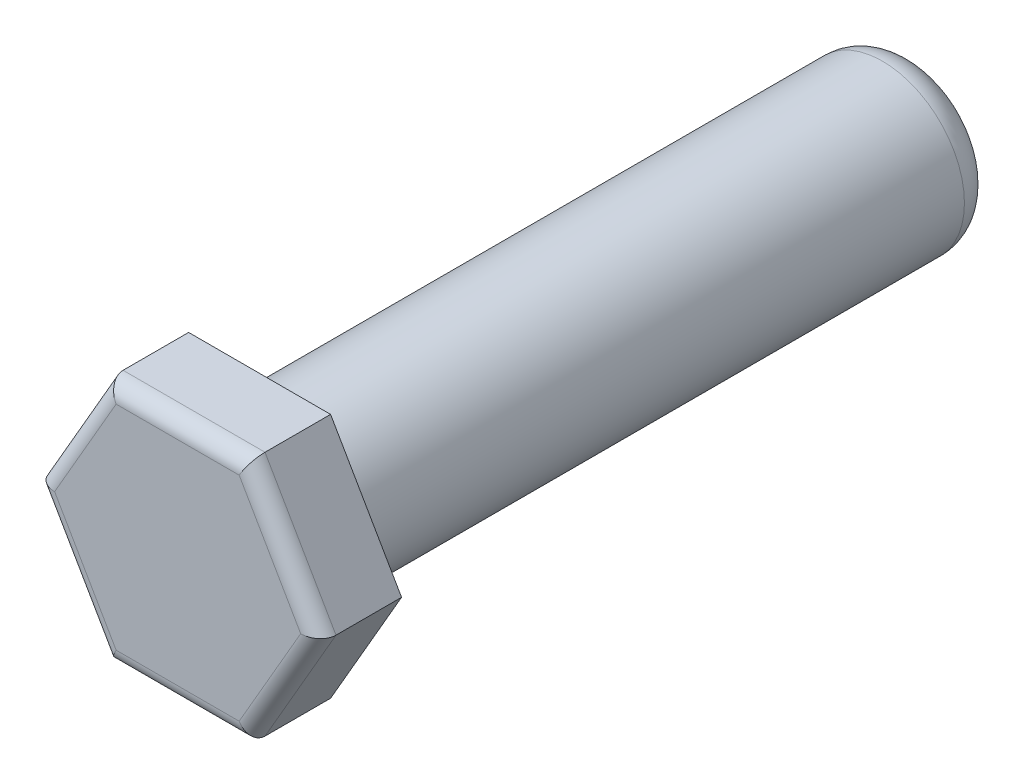
ISO-10303-21;
HEADER;
FILE_DESCRIPTION(('STEP AP214'),'2;1');
FILE_NAME('part.step','',(''),(''),'','','');
FILE_SCHEMA(('AUTOMOTIVE_DESIGN { 1 0 10303 214 1 1 1 1 }'));
ENDSEC;
DATA;
#1=APPLICATION_CONTEXT('core data for automotive mechanical design processes');
#2=APPLICATION_PROTOCOL_DEFINITION('international standard','automotive_design',2000,#1);
#3=PRODUCT_CONTEXT('',#1,'mechanical');
#4=PRODUCT('Part','Part','',(#3));
#5=PRODUCT_RELATED_PRODUCT_CATEGORY('part','',(#4));
#6=PRODUCT_DEFINITION_FORMATION('','',#4);
#7=PRODUCT_DEFINITION_CONTEXT('part definition',#1,'design');
#8=PRODUCT_DEFINITION('design','',#6,#7);
#9=PRODUCT_DEFINITION_SHAPE('','',#8);
#10=(LENGTH_UNIT() NAMED_UNIT(*) SI_UNIT(.MILLI.,.METRE.));
#11=(NAMED_UNIT(*) PLANE_ANGLE_UNIT() SI_UNIT($,.RADIAN.));
#12=(NAMED_UNIT(*) SI_UNIT($,.STERADIAN.) SOLID_ANGLE_UNIT());
#13=UNCERTAINTY_MEASURE_WITH_UNIT(LENGTH_MEASURE(1.E-05),#10,'distance_accuracy_value','');
#14=(GEOMETRIC_REPRESENTATION_CONTEXT(3) GLOBAL_UNCERTAINTY_ASSIGNED_CONTEXT((#13)) GLOBAL_UNIT_ASSIGNED_CONTEXT((#10,
#11,#12)) REPRESENTATION_CONTEXT('',''));
#15=CARTESIAN_POINT('',(0.,0.,0.));
#16=DIRECTION('',(0.,0.,1.));
#17=DIRECTION('',(1.,0.,0.));
#18=AXIS2_PLACEMENT_3D('',#15,#16,#17);
#19=CARTESIAN_POINT('',(0.,0.,40.));
#20=DIRECTION('',(0.,0.,-1.));
#21=DIRECTION('',(-1.,0.,0.));
#22=AXIS2_PLACEMENT_3D('',#19,#20,#21);
#23=CYLINDRICAL_SURFACE('',#22,5.);
#24=CARTESIAN_POINT('',(0.,0.,2.));
#25=DIRECTION('',(0.,0.,1.));
#26=DIRECTION('',(1.,0.,0.));
#27=AXIS2_PLACEMENT_3D('',#24,#25,#26);
#28=CIRCLE('',#27,5.);
#29=CARTESIAN_POINT('',(5.,0.,2.));
#30=VERTEX_POINT('',#29);
#31=EDGE_CURVE('E42',#30,#30,#28,.T.);
#32=ORIENTED_EDGE('',*,*,#31,.T.);
#33=EDGE_LOOP('',(#32));
#34=FACE_BOUND('',#33,.T.);
#35=CARTESIAN_POINT('',(0.,0.,40.));
#36=DIRECTION('',(0.,0.,1.));
#37=DIRECTION('',(1.,0.,0.));
#38=AXIS2_PLACEMENT_3D('',#35,#36,#37);
#39=CIRCLE('',#38,5.);
#40=CARTESIAN_POINT('',(5.,0.,40.));
#41=VERTEX_POINT('',#40);
#42=EDGE_CURVE('E117',#41,#41,#39,.T.);
#43=ORIENTED_EDGE('',*,*,#42,.F.);
#44=EDGE_LOOP('',(#43));
#45=FACE_BOUND('',#44,.T.);
#46=ADVANCED_FACE('F34',(#34,#45),#23,.T.);
#47=CARTESIAN_POINT('',(0.,0.,0.));
#48=DIRECTION('',(0.,0.,1.));
#49=DIRECTION('',(1.,0.,0.));
#50=AXIS2_PLACEMENT_3D('',#47,#48,#49);
#51=PLANE('',#50);
#52=CARTESIAN_POINT('',(0.,0.,0.));
#53=DIRECTION('',(0.,0.,1.));
#54=DIRECTION('',(1.,0.,0.));
#55=AXIS2_PLACEMENT_3D('',#52,#53,#54);
#56=CIRCLE('',#55,3.);
#57=CARTESIAN_POINT('',(3.,0.,0.));
#58=VERTEX_POINT('',#57);
#59=EDGE_CURVE('E11',#58,#58,#56,.F.);
#60=ORIENTED_EDGE('',*,*,#59,.T.);
#61=EDGE_LOOP('',(#60));
#62=FACE_BOUND('',#61,.T.);
#63=ADVANCED_FACE('F208',(#62),#51,.F.);
#64=CARTESIAN_POINT('',(0.,0.,40.));
#65=DIRECTION('',(0.,0.,1.));
#66=DIRECTION('',(1.,0.,0.));
#67=AXIS2_PLACEMENT_3D('',#64,#65,#66);
#68=PLANE('',#67);
#69=DIRECTION('',(1.,0.,0.));
#70=VECTOR('',#69,1.);
#71=CARTESIAN_POINT('',(-4.33012701892219,-7.5,40.));
#72=LINE('',#71,#70);
#73=CARTESIAN_POINT('',(-4.33012701892219,-7.5,40.));
#74=VERTEX_POINT('',#73);
#75=CARTESIAN_POINT('',(4.33012701892219,-7.5,40.));
#76=VERTEX_POINT('',#75);
#77=EDGE_CURVE('E125',#74,#76,#72,.T.);
#78=ORIENTED_EDGE('',*,*,#77,.F.);
#79=DIRECTION('',(0.5,-0.866025403784438,0.));
#80=VECTOR('',#79,1.);
#81=CARTESIAN_POINT('',(-8.66025403784439,0.,40.));
#82=LINE('',#81,#80);
#83=CARTESIAN_POINT('',(-8.66025403784439,0.,40.));
#84=VERTEX_POINT('',#83);
#85=EDGE_CURVE('E146',#84,#74,#82,.T.);
#86=ORIENTED_EDGE('',*,*,#85,.F.);
#87=DIRECTION('',(-0.5,-0.866025403784439,0.));
#88=VECTOR('',#87,1.);
#89=CARTESIAN_POINT('',(-4.33012701892219,7.5,40.));
#90=LINE('',#89,#88);
#91=CARTESIAN_POINT('',(-4.33012701892219,7.5,40.));
#92=VERTEX_POINT('',#91);
#93=EDGE_CURVE('E143',#92,#84,#90,.T.);
#94=ORIENTED_EDGE('',*,*,#93,.F.);
#95=DIRECTION('',(-1.,0.,0.));
#96=VECTOR('',#95,1.);
#97=CARTESIAN_POINT('',(4.33012701892219,7.5,40.));
#98=LINE('',#97,#96);
#99=CARTESIAN_POINT('',(4.33012701892219,7.5,40.));
#100=VERTEX_POINT('',#99);
#101=EDGE_CURVE('E140',#100,#92,#98,.T.);
#102=ORIENTED_EDGE('',*,*,#101,.F.);
#103=DIRECTION('',(-0.500000000000001,0.866025403784438,0.));
#104=VECTOR('',#103,1.);
#105=CARTESIAN_POINT('',(8.66025403784439,0.,40.));
#106=LINE('',#105,#104);
#107=CARTESIAN_POINT('',(8.66025403784439,0.,40.));
#108=VERTEX_POINT('',#107);
#109=EDGE_CURVE('E128',#108,#100,#106,.T.);
#110=ORIENTED_EDGE('',*,*,#109,.F.);
#111=DIRECTION('',(0.5,0.866025403784439,0.));
#112=VECTOR('',#111,1.);
#113=CARTESIAN_POINT('',(4.33012701892219,-7.5,40.));
#114=LINE('',#113,#112);
#115=EDGE_CURVE('E110',#76,#108,#114,.T.);
#116=ORIENTED_EDGE('',*,*,#115,.F.);
#117=EDGE_LOOP('',(#78,#86,#94,#102,#110,#116));
#118=FACE_BOUND('',#117,.T.);
#119=ORIENTED_EDGE('',*,*,#42,.T.);
#120=EDGE_LOOP('',(#119));
#121=FACE_BOUND('',#120,.T.);
#122=ADVANCED_FACE('F122',(#118,#121),#68,.F.);
#123=CARTESIAN_POINT('',(-4.33012701892219,-7.5,45.));
#124=DIRECTION('',(0.,1.,0.));
#125=DIRECTION('',(-1.,0.,0.));
#126=AXIS2_PLACEMENT_3D('',#123,#124,#125);
#127=PLANE('',#126);
#128=DIRECTION('',(0.,0.,-1.));
#129=VECTOR('',#128,1.);
#130=CARTESIAN_POINT('',(4.33012701892219,-7.5,45.));
#131=LINE('',#130,#129);
#132=CARTESIAN_POINT('',(4.33012701892219,-7.5,44.));
#133=VERTEX_POINT('',#132);
#134=EDGE_CURVE('E106',#133,#76,#131,.T.);
#135=ORIENTED_EDGE('',*,*,#134,.F.);
#136=DIRECTION('',(1.,0.,0.));
#137=VECTOR('',#136,1.);
#138=CARTESIAN_POINT('',(-4.33012701892219,-7.5,44.));
#139=LINE('',#138,#137);
#140=CARTESIAN_POINT('',(-4.33012701892219,-7.5,44.));
#141=VERTEX_POINT('',#140);
#142=EDGE_CURVE('E175',#133,#141,#139,.F.);
#143=ORIENTED_EDGE('',*,*,#142,.T.);
#144=DIRECTION('',(0.,0.,-1.));
#145=VECTOR('',#144,1.);
#146=CARTESIAN_POINT('',(-4.33012701892219,-7.5,45.));
#147=LINE('',#146,#145);
#148=EDGE_CURVE('E131',#141,#74,#147,.T.);
#149=ORIENTED_EDGE('',*,*,#148,.T.);
#150=ORIENTED_EDGE('',*,*,#77,.T.);
#151=EDGE_LOOP('',(#135,#143,#149,#150));
#152=FACE_BOUND('',#151,.T.);
#153=ADVANCED_FACE('F130',(#152),#127,.F.);
#154=CARTESIAN_POINT('',(4.33012701892219,-7.5,45.));
#155=DIRECTION('',(-0.866025403784439,0.5,0.));
#156=DIRECTION('',(-0.5,-0.866025403784439,0.));
#157=AXIS2_PLACEMENT_3D('',#154,#155,#156);
#158=PLANE('',#157);
#159=DIRECTION('',(0.,0.,-1.));
#160=VECTOR('',#159,1.);
#161=CARTESIAN_POINT('',(8.66025403784439,0.,45.));
#162=LINE('',#161,#160);
#163=CARTESIAN_POINT('',(8.66025403784439,0.,44.));
#164=VERTEX_POINT('',#163);
#165=EDGE_CURVE('E118',#164,#108,#162,.T.);
#166=ORIENTED_EDGE('',*,*,#165,.F.);
#167=DIRECTION('',(0.5,0.866025403784439,0.));
#168=VECTOR('',#167,1.);
#169=CARTESIAN_POINT('',(4.33012701892219,-7.5,44.));
#170=LINE('',#169,#168);
#171=EDGE_CURVE('E113',#164,#133,#170,.F.);
#172=ORIENTED_EDGE('',*,*,#171,.T.);
#173=ORIENTED_EDGE('',*,*,#134,.T.);
#174=ORIENTED_EDGE('',*,*,#115,.T.);
#175=EDGE_LOOP('',(#166,#172,#173,#174));
#176=FACE_BOUND('',#175,.T.);
#177=ADVANCED_FACE('F109',(#176),#158,.F.);
#178=CARTESIAN_POINT('',(8.66025403784439,0.,45.));
#179=DIRECTION('',(-0.866025403784438,-0.500000000000001,0.));
#180=DIRECTION('',(0.500000000000001,-0.866025403784438,0.));
#181=AXIS2_PLACEMENT_3D('',#178,#179,#180);
#182=PLANE('',#181);
#183=DIRECTION('',(0.,0.,-1.));
#184=VECTOR('',#183,1.);
#185=CARTESIAN_POINT('',(4.33012701892219,7.5,45.));
#186=LINE('',#185,#184);
#187=CARTESIAN_POINT('',(4.33012701892219,7.5,44.));
#188=VERTEX_POINT('',#187);
#189=EDGE_CURVE('E153',#188,#100,#186,.T.);
#190=ORIENTED_EDGE('',*,*,#189,.F.);
#191=DIRECTION('',(-0.500000000000001,0.866025403784438,0.));
#192=VECTOR('',#191,1.);
#193=CARTESIAN_POINT('',(8.66025403784439,0.,44.));
#194=LINE('',#193,#192);
#195=EDGE_CURVE('E171',#188,#164,#194,.F.);
#196=ORIENTED_EDGE('',*,*,#195,.T.);
#197=ORIENTED_EDGE('',*,*,#165,.T.);
#198=ORIENTED_EDGE('',*,*,#109,.T.);
#199=EDGE_LOOP('',(#190,#196,#197,#198));
#200=FACE_BOUND('',#199,.T.);
#201=ADVANCED_FACE('F254',(#200),#182,.F.);
#202=CARTESIAN_POINT('',(4.33012701892219,7.5,45.));
#203=DIRECTION('',(0.,-1.,0.));
#204=DIRECTION('',(0.,0.,-1.));
#205=AXIS2_PLACEMENT_3D('',#202,#203,#204);
#206=PLANE('',#205);
#207=DIRECTION('',(0.,0.,-1.));
#208=VECTOR('',#207,1.);
#209=CARTESIAN_POINT('',(-4.33012701892219,7.5,45.));
#210=LINE('',#209,#208);
#211=CARTESIAN_POINT('',(-4.33012701892219,7.5,44.));
#212=VERTEX_POINT('',#211);
#213=EDGE_CURVE('E151',#212,#92,#210,.T.);
#214=ORIENTED_EDGE('',*,*,#213,.F.);
#215=DIRECTION('',(-1.,0.,0.));
#216=VECTOR('',#215,1.);
#217=CARTESIAN_POINT('',(4.33012701892219,7.5,44.));
#218=LINE('',#217,#216);
#219=EDGE_CURVE('E179',#212,#188,#218,.F.);
#220=ORIENTED_EDGE('',*,*,#219,.T.);
#221=ORIENTED_EDGE('',*,*,#189,.T.);
#222=ORIENTED_EDGE('',*,*,#101,.T.);
#223=EDGE_LOOP('',(#214,#220,#221,#222));
#224=FACE_BOUND('',#223,.T.);
#225=ADVANCED_FACE('F251',(#224),#206,.F.);
#226=CARTESIAN_POINT('',(-4.33012701892219,7.5,45.));
#227=DIRECTION('',(0.866025403784439,-0.5,0.));
#228=DIRECTION('',(0.5,0.866025403784439,0.));
#229=AXIS2_PLACEMENT_3D('',#226,#227,#228);
#230=PLANE('',#229);
#231=DIRECTION('',(0.,0.,-1.));
#232=VECTOR('',#231,1.);
#233=CARTESIAN_POINT('',(-8.66025403784439,0.,45.));
#234=LINE('',#233,#232);
#235=CARTESIAN_POINT('',(-8.66025403784439,0.,44.));
#236=VERTEX_POINT('',#235);
#237=EDGE_CURVE('E149',#236,#84,#234,.T.);
#238=ORIENTED_EDGE('',*,*,#237,.F.);
#239=DIRECTION('',(-0.5,-0.866025403784439,0.));
#240=VECTOR('',#239,1.);
#241=CARTESIAN_POINT('',(-4.33012701892219,7.5,44.));
#242=LINE('',#241,#240);
#243=EDGE_CURVE('E49',#236,#212,#242,.F.);
#244=ORIENTED_EDGE('',*,*,#243,.T.);
#245=ORIENTED_EDGE('',*,*,#213,.T.);
#246=ORIENTED_EDGE('',*,*,#93,.T.);
#247=EDGE_LOOP('',(#238,#244,#245,#246));
#248=FACE_BOUND('',#247,.T.);
#249=ADVANCED_FACE('F261',(#248),#230,.F.);
#250=CARTESIAN_POINT('',(-8.66025403784439,0.,45.));
#251=DIRECTION('',(0.866025403784438,0.5,0.));
#252=DIRECTION('',(-0.5,0.866025403784439,0.));
#253=AXIS2_PLACEMENT_3D('',#250,#251,#252);
#254=PLANE('',#253);
#255=ORIENTED_EDGE('',*,*,#148,.F.);
#256=DIRECTION('',(0.5,-0.866025403784439,0.));
#257=VECTOR('',#256,1.);
#258=CARTESIAN_POINT('',(-8.66025403784439,0.,44.));
#259=LINE('',#258,#257);
#260=EDGE_CURVE('E57',#141,#236,#259,.F.);
#261=ORIENTED_EDGE('',*,*,#260,.T.);
#262=ORIENTED_EDGE('',*,*,#237,.T.);
#263=ORIENTED_EDGE('',*,*,#85,.T.);
#264=EDGE_LOOP('',(#255,#261,#262,#263));
#265=FACE_BOUND('',#264,.T.);
#266=ADVANCED_FACE('F238',(#265),#254,.F.);
#267=CARTESIAN_POINT('',(0.,0.,45.));
#268=DIRECTION('',(0.,0.,1.));
#269=DIRECTION('',(1.,0.,0.));
#270=AXIS2_PLACEMENT_3D('',#267,#268,#269);
#271=PLANE('',#270);
#272=DIRECTION('',(0.5,0.866025403784439,0.));
#273=VECTOR('',#272,1.);
#274=CARTESIAN_POINT('',(7.79422863405995,0.500000000000006,45.));
#275=LINE('',#274,#273);
#276=CARTESIAN_POINT('',(3.75277674973257,-6.5,45.));
#277=VERTEX_POINT('',#276);
#278=CARTESIAN_POINT('',(7.50555349946513,0.,45.));
#279=VERTEX_POINT('',#278);
#280=EDGE_CURVE('E166',#277,#279,#275,.T.);
#281=ORIENTED_EDGE('',*,*,#280,.T.);
#282=DIRECTION('',(-0.500000000000001,0.866025403784438,0.));
#283=VECTOR('',#282,1.);
#284=CARTESIAN_POINT('',(3.46410161513775,7.,45.));
#285=LINE('',#284,#283);
#286=CARTESIAN_POINT('',(3.75277674973256,6.5,45.));
#287=VERTEX_POINT('',#286);
#288=EDGE_CURVE('E168',#279,#287,#285,.T.);
#289=ORIENTED_EDGE('',*,*,#288,.T.);
#290=DIRECTION('',(-1.,0.,0.));
#291=VECTOR('',#290,1.);
#292=CARTESIAN_POINT('',(-4.33012701892219,6.5,45.));
#293=LINE('',#292,#291);
#294=CARTESIAN_POINT('',(-3.75277674973257,6.5,45.));
#295=VERTEX_POINT('',#294);
#296=EDGE_CURVE('E158',#287,#295,#293,.T.);
#297=ORIENTED_EDGE('',*,*,#296,.T.);
#298=DIRECTION('',(-0.5,-0.866025403784439,0.));
#299=VECTOR('',#298,1.);
#300=CARTESIAN_POINT('',(-7.79422863405995,-0.499999999999999,45.));
#301=LINE('',#300,#299);
#302=CARTESIAN_POINT('',(-7.50555349946513,0.,45.));
#303=VERTEX_POINT('',#302);
#304=EDGE_CURVE('E160',#295,#303,#301,.T.);
#305=ORIENTED_EDGE('',*,*,#304,.T.);
#306=DIRECTION('',(0.5,-0.866025403784439,0.));
#307=VECTOR('',#306,1.);
#308=CARTESIAN_POINT('',(-3.46410161513775,-7.,45.));
#309=LINE('',#308,#307);
#310=CARTESIAN_POINT('',(-3.75277674973257,-6.5,45.));
#311=VERTEX_POINT('',#310);
#312=EDGE_CURVE('E162',#303,#311,#309,.T.);
#313=ORIENTED_EDGE('',*,*,#312,.T.);
#314=DIRECTION('',(1.,0.,0.));
#315=VECTOR('',#314,1.);
#316=CARTESIAN_POINT('',(4.33012701892219,-6.5,45.));
#317=LINE('',#316,#315);
#318=EDGE_CURVE('E164',#311,#277,#317,.T.);
#319=ORIENTED_EDGE('',*,*,#318,.T.);
#320=EDGE_LOOP('',(#281,#289,#297,#305,#313,#319));
#321=FACE_BOUND('',#320,.T.);
#322=ADVANCED_FACE('F233',(#321),#271,.T.);
#323=CARTESIAN_POINT('',(-5.62916512459885,-3.25,44.));
#324=DIRECTION('',(-0.5,0.866025403784439,0.));
#325=DIRECTION('',(-0.866025403784438,-0.5,0.));
#326=AXIS2_PLACEMENT_3D('',#323,#324,#325);
#327=CYLINDRICAL_SURFACE('',#326,1.);
#328=CARTESIAN_POINT('',(-7.50555349946513,0.,44.));
#329=DIRECTION('',(0.,1.,0.));
#330=DIRECTION('',(1.,0.,0.));
#331=AXIS2_PLACEMENT_3D('',#328,#329,#330);
#332=ELLIPSE('',#331,1.15470053837925,1.);
#333=EDGE_CURVE('E136',#236,#303,#332,.T.);
#334=ORIENTED_EDGE('',*,*,#333,.F.);
#335=ORIENTED_EDGE('',*,*,#260,.F.);
#336=CARTESIAN_POINT('',(-3.75277674973257,-6.5,44.));
#337=DIRECTION('',(-0.866025403784439,0.5,0.));
#338=DIRECTION('',(0.5,0.866025403784439,0.));
#339=AXIS2_PLACEMENT_3D('',#336,#337,#338);
#340=ELLIPSE('',#339,1.15470053837925,1.);
#341=EDGE_CURVE('E133',#311,#141,#340,.F.);
#342=ORIENTED_EDGE('',*,*,#341,.F.);
#343=ORIENTED_EDGE('',*,*,#312,.F.);
#344=EDGE_LOOP('',(#334,#335,#342,#343));
#345=FACE_BOUND('',#344,.T.);
#346=ADVANCED_FACE('F230',(#345),#327,.T.);
#347=CARTESIAN_POINT('',(0.,-6.5,44.));
#348=DIRECTION('',(-1.,0.,0.));
#349=DIRECTION('',(0.,-1.,0.));
#350=AXIS2_PLACEMENT_3D('',#347,#348,#349);
#351=CYLINDRICAL_SURFACE('',#350,1.);
#352=ORIENTED_EDGE('',*,*,#341,.T.);
#353=ORIENTED_EDGE('',*,*,#142,.F.);
#354=CARTESIAN_POINT('',(3.75277674973256,-6.5,44.));
#355=DIRECTION('',(-0.866025403784439,-0.5,0.));
#356=DIRECTION('',(-0.5,0.866025403784439,0.));
#357=AXIS2_PLACEMENT_3D('',#354,#355,#356);
#358=ELLIPSE('',#357,1.15470053837925,1.);
#359=EDGE_CURVE('E188',#277,#133,#358,.F.);
#360=ORIENTED_EDGE('',*,*,#359,.F.);
#361=ORIENTED_EDGE('',*,*,#318,.F.);
#362=EDGE_LOOP('',(#352,#353,#360,#361));
#363=FACE_BOUND('',#362,.T.);
#364=ADVANCED_FACE('F227',(#363),#351,.T.);
#365=CARTESIAN_POINT('',(-5.62916512459885,3.25,44.));
#366=DIRECTION('',(0.5,0.866025403784439,0.));
#367=DIRECTION('',(-0.866025403784439,0.5,0.));
#368=AXIS2_PLACEMENT_3D('',#365,#366,#367);
#369=CYLINDRICAL_SURFACE('',#368,1.);
#370=ORIENTED_EDGE('',*,*,#333,.T.);
#371=ORIENTED_EDGE('',*,*,#304,.F.);
#372=CARTESIAN_POINT('',(-3.75277674973257,6.5,44.));
#373=DIRECTION('',(0.866025403784439,0.5,0.));
#374=DIRECTION('',(0.5,-0.866025403784439,0.));
#375=AXIS2_PLACEMENT_3D('',#372,#373,#374);
#376=ELLIPSE('',#375,1.15470053837925,1.);
#377=EDGE_CURVE('E185',#212,#295,#376,.T.);
#378=ORIENTED_EDGE('',*,*,#377,.F.);
#379=ORIENTED_EDGE('',*,*,#243,.F.);
#380=EDGE_LOOP('',(#370,#371,#378,#379));
#381=FACE_BOUND('',#380,.T.);
#382=ADVANCED_FACE('F223',(#381),#369,.T.);
#383=CARTESIAN_POINT('',(5.62916512459885,-3.25,44.));
#384=DIRECTION('',(-0.5,-0.866025403784439,0.));
#385=DIRECTION('',(0.866025403784439,-0.5,0.));
#386=AXIS2_PLACEMENT_3D('',#383,#384,#385);
#387=CYLINDRICAL_SURFACE('',#386,1.);
#388=ORIENTED_EDGE('',*,*,#359,.T.);
#389=ORIENTED_EDGE('',*,*,#171,.F.);
#390=CARTESIAN_POINT('',(7.50555349946513,0.,44.));
#391=DIRECTION('',(0.,-1.,0.));
#392=DIRECTION('',(-1.,0.,0.));
#393=AXIS2_PLACEMENT_3D('',#390,#391,#392);
#394=ELLIPSE('',#393,1.15470053837925,1.);
#395=EDGE_CURVE('E183',#279,#164,#394,.F.);
#396=ORIENTED_EDGE('',*,*,#395,.F.);
#397=ORIENTED_EDGE('',*,*,#280,.F.);
#398=EDGE_LOOP('',(#388,#389,#396,#397));
#399=FACE_BOUND('',#398,.T.);
#400=ADVANCED_FACE('F219',(#399),#387,.T.);
#401=CARTESIAN_POINT('',(0.,6.5,44.));
#402=DIRECTION('',(1.,0.,0.));
#403=DIRECTION('',(0.,0.,-1.));
#404=AXIS2_PLACEMENT_3D('',#401,#402,#403);
#405=CYLINDRICAL_SURFACE('',#404,1.);
#406=ORIENTED_EDGE('',*,*,#377,.T.);
#407=ORIENTED_EDGE('',*,*,#296,.F.);
#408=CARTESIAN_POINT('',(3.75277674973256,6.5,44.));
#409=DIRECTION('',(0.866025403784439,-0.5,0.));
#410=DIRECTION('',(0.5,0.866025403784439,0.));
#411=AXIS2_PLACEMENT_3D('',#408,#409,#410);
#412=ELLIPSE('',#411,1.15470053837925,1.);
#413=EDGE_CURVE('E181',#188,#287,#412,.T.);
#414=ORIENTED_EDGE('',*,*,#413,.F.);
#415=ORIENTED_EDGE('',*,*,#219,.F.);
#416=EDGE_LOOP('',(#406,#407,#414,#415));
#417=FACE_BOUND('',#416,.T.);
#418=ADVANCED_FACE('F203',(#417),#405,.T.);
#419=CARTESIAN_POINT('',(5.62916512459885,3.25,44.));
#420=DIRECTION('',(0.500000000000001,-0.866025403784438,0.));
#421=DIRECTION('',(0.866025403784438,0.500000000000001,0.));
#422=AXIS2_PLACEMENT_3D('',#419,#420,#421);
#423=CYLINDRICAL_SURFACE('',#422,1.);
#424=ORIENTED_EDGE('',*,*,#395,.T.);
#425=ORIENTED_EDGE('',*,*,#195,.F.);
#426=ORIENTED_EDGE('',*,*,#413,.T.);
#427=ORIENTED_EDGE('',*,*,#288,.F.);
#428=EDGE_LOOP('',(#424,#425,#426,#427));
#429=FACE_BOUND('',#428,.T.);
#430=ADVANCED_FACE('F198',(#429),#423,.T.);
#431=CARTESIAN_POINT('',(0.,0.,2.));
#432=DIRECTION('',(0.,0.,1.));
#433=DIRECTION('',(1.,0.,0.));
#434=AXIS2_PLACEMENT_3D('',#431,#432,#433);
#435=TOROIDAL_SURFACE('',#434,3.,2.);
#436=ORIENTED_EDGE('',*,*,#59,.F.);
#437=EDGE_LOOP('',(#436));
#438=FACE_BOUND('',#437,.T.);
#439=ORIENTED_EDGE('',*,*,#31,.F.);
#440=EDGE_LOOP('',(#439));
#441=FACE_BOUND('',#440,.T.);
#442=ADVANCED_FACE('F36',(#438,#441),#435,.T.);
#443=CLOSED_SHELL('',(#46,#63,#122,#153,#177,#201,#225,#249,#266,#322,#346,#364,#382,#400,#418,
#430,#442));
#444=MANIFOLD_SOLID_BREP('B2',#443);
#445=ADVANCED_BREP_SHAPE_REPRESENTATION('',(#18,#444),#14);
#446=SHAPE_DEFINITION_REPRESENTATION(#9,#445);
ENDSEC;
END-ISO-10303-21;
